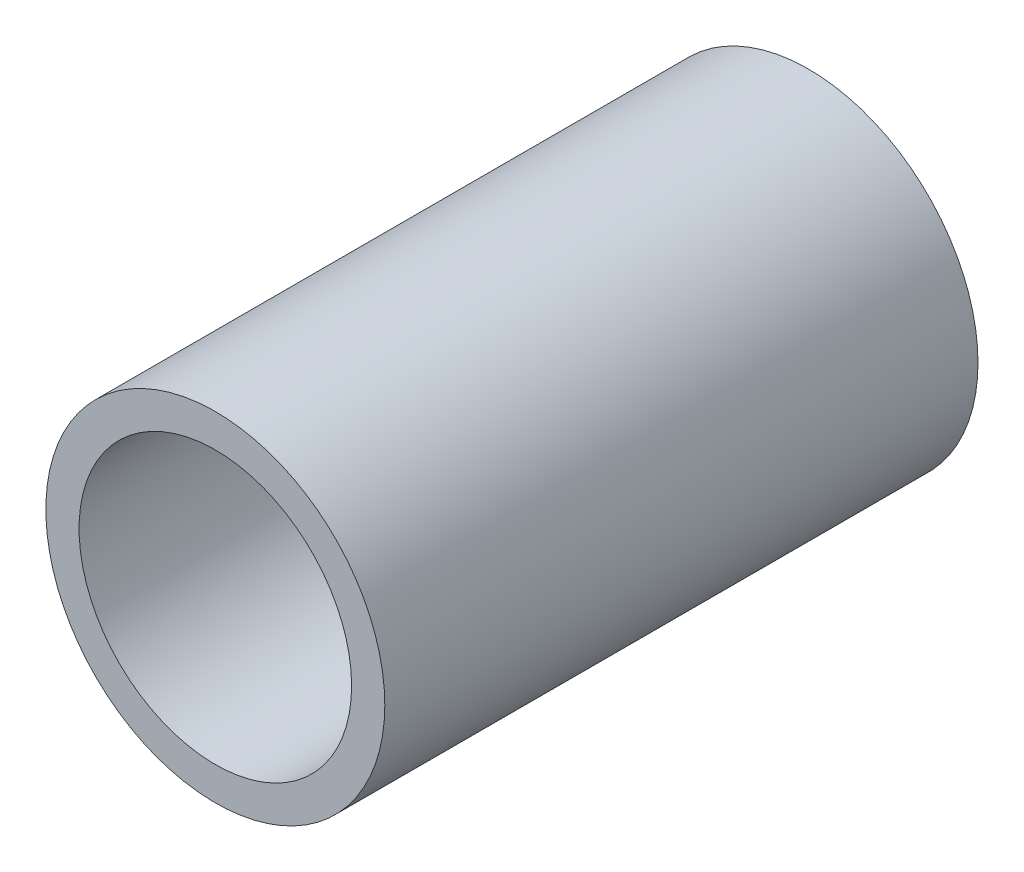
ISO-10303-21;
HEADER;
FILE_DESCRIPTION(('STEP AP214'),'2;1');
FILE_NAME('part.step','',(''),(''),'','','');
FILE_SCHEMA(('AUTOMOTIVE_DESIGN { 1 0 10303 214 1 1 1 1 }'));
ENDSEC;
DATA;
#1=APPLICATION_CONTEXT('core data for automotive mechanical design processes');
#2=APPLICATION_PROTOCOL_DEFINITION('international standard','automotive_design',2000,#1);
#3=PRODUCT_CONTEXT('',#1,'mechanical');
#4=PRODUCT('Part','Part','',(#3));
#5=PRODUCT_RELATED_PRODUCT_CATEGORY('part','',(#4));
#6=PRODUCT_DEFINITION_FORMATION('','',#4);
#7=PRODUCT_DEFINITION_CONTEXT('part definition',#1,'design');
#8=PRODUCT_DEFINITION('design','',#6,#7);
#9=PRODUCT_DEFINITION_SHAPE('','',#8);
#10=(LENGTH_UNIT() NAMED_UNIT(*) SI_UNIT(.MILLI.,.METRE.));
#11=(NAMED_UNIT(*) PLANE_ANGLE_UNIT() SI_UNIT($,.RADIAN.));
#12=(NAMED_UNIT(*) SI_UNIT($,.STERADIAN.) SOLID_ANGLE_UNIT());
#13=UNCERTAINTY_MEASURE_WITH_UNIT(LENGTH_MEASURE(1.E-05),#10,'distance_accuracy_value','');
#14=(GEOMETRIC_REPRESENTATION_CONTEXT(3) GLOBAL_UNCERTAINTY_ASSIGNED_CONTEXT((#13)) GLOBAL_UNIT_ASSIGNED_CONTEXT((#10,
#11,#12)) REPRESENTATION_CONTEXT('',''));
#15=CARTESIAN_POINT('',(0.,0.,0.));
#16=DIRECTION('',(0.,0.,1.));
#17=DIRECTION('',(1.,0.,0.));
#18=AXIS2_PLACEMENT_3D('',#15,#16,#17);
#19=CARTESIAN_POINT('',(0.,0.,70.));
#20=DIRECTION('',(0.,0.,-1.));
#21=DIRECTION('',(-1.,0.,0.));
#22=AXIS2_PLACEMENT_3D('',#19,#20,#21);
#23=CYLINDRICAL_SURFACE('',#22,20.);
#24=CARTESIAN_POINT('',(0.,0.,70.));
#25=DIRECTION('',(0.,0.,1.));
#26=DIRECTION('',(1.,0.,0.));
#27=AXIS2_PLACEMENT_3D('',#24,#25,#26);
#28=CIRCLE('',#27,20.);
#29=CARTESIAN_POINT('',(20.,0.,70.));
#30=VERTEX_POINT('',#29);
#31=EDGE_CURVE('E10',#30,#30,#28,.T.);
#32=ORIENTED_EDGE('',*,*,#31,.F.);
#33=EDGE_LOOP('',(#32));
#34=FACE_BOUND('',#33,.T.);
#35=CARTESIAN_POINT('',(0.,0.,0.));
#36=DIRECTION('',(0.,0.,1.));
#37=DIRECTION('',(1.,0.,0.));
#38=AXIS2_PLACEMENT_3D('',#35,#36,#37);
#39=CIRCLE('',#38,20.);
#40=CARTESIAN_POINT('',(20.,0.,0.));
#41=VERTEX_POINT('',#40);
#42=EDGE_CURVE('E39',#41,#41,#39,.T.);
#43=ORIENTED_EDGE('',*,*,#42,.T.);
#44=EDGE_LOOP('',(#43));
#45=FACE_BOUND('',#44,.T.);
#46=ADVANCED_FACE('F36',(#34,#45),#23,.T.);
#47=CARTESIAN_POINT('',(0.,0.,70.));
#48=DIRECTION('',(0.,0.,1.));
#49=DIRECTION('',(1.,0.,0.));
#50=AXIS2_PLACEMENT_3D('',#47,#48,#49);
#51=PLANE('',#50);
#52=CARTESIAN_POINT('',(0.,0.,70.));
#53=DIRECTION('',(0.,0.,1.));
#54=DIRECTION('',(1.,0.,0.));
#55=AXIS2_PLACEMENT_3D('',#52,#53,#54);
#56=CIRCLE('',#55,16.0812894862419);
#57=CARTESIAN_POINT('',(16.0812894862419,0.,70.));
#58=VERTEX_POINT('',#57);
#59=EDGE_CURVE('E50',#58,#58,#56,.T.);
#60=ORIENTED_EDGE('',*,*,#59,.F.);
#61=EDGE_LOOP('',(#60));
#62=FACE_BOUND('',#61,.T.);
#63=ORIENTED_EDGE('',*,*,#31,.T.);
#64=EDGE_LOOP('',(#63));
#65=FACE_BOUND('',#64,.T.);
#66=ADVANCED_FACE('F67',(#62,#65),#51,.T.);
#67=CARTESIAN_POINT('',(0.,0.,0.));
#68=DIRECTION('',(0.,0.,1.));
#69=DIRECTION('',(1.,0.,0.));
#70=AXIS2_PLACEMENT_3D('',#67,#68,#69);
#71=PLANE('',#70);
#72=ORIENTED_EDGE('',*,*,#42,.F.);
#73=EDGE_LOOP('',(#72));
#74=FACE_BOUND('',#73,.T.);
#75=ADVANCED_FACE('F63',(#74),#71,.F.);
#76=CARTESIAN_POINT('',(0.,0.,10.));
#77=DIRECTION('',(0.,0.,1.));
#78=DIRECTION('',(1.,0.,0.));
#79=AXIS2_PLACEMENT_3D('',#76,#77,#78);
#80=CYLINDRICAL_SURFACE('',#79,16.0812894862419);
#81=CARTESIAN_POINT('',(0.,0.,10.));
#82=DIRECTION('',(0.,0.,1.));
#83=DIRECTION('',(1.,0.,0.));
#84=AXIS2_PLACEMENT_3D('',#81,#82,#83);
#85=CIRCLE('',#84,16.0812894862419);
#86=CARTESIAN_POINT('',(16.0812894862419,0.,10.));
#87=VERTEX_POINT('',#86);
#88=EDGE_CURVE('E48',#87,#87,#85,.T.);
#89=CARTESIAN_POINT('',(16.0812894862419,0.,10.));
#90=CARTESIAN_POINT('',(16.0812894862419,0.,10.625));
#91=CARTESIAN_POINT('',(16.0812894862419,0.,11.25));
#92=CARTESIAN_POINT('',(16.0812894862419,0.,12.5));
#93=CARTESIAN_POINT('',(16.0812894862419,0.,13.125));
#94=CARTESIAN_POINT('',(16.0812894862419,0.,14.375));
#95=CARTESIAN_POINT('',(16.0812894862419,0.,15.));
#96=CARTESIAN_POINT('',(16.0812894862419,0.,16.25));
#97=CARTESIAN_POINT('',(16.0812894862419,0.,16.875));
#98=CARTESIAN_POINT('',(16.0812894862419,0.,18.125));
#99=CARTESIAN_POINT('',(16.0812894862419,0.,18.75));
#100=CARTESIAN_POINT('',(16.0812894862419,0.,20.));
#101=CARTESIAN_POINT('',(16.0812894862419,0.,20.625));
#102=CARTESIAN_POINT('',(16.0812894862419,0.,21.875));
#103=CARTESIAN_POINT('',(16.0812894862419,0.,22.5));
#104=CARTESIAN_POINT('',(16.0812894862419,0.,23.75));
#105=CARTESIAN_POINT('',(16.0812894862419,0.,24.375));
#106=CARTESIAN_POINT('',(16.0812894862419,0.,25.625));
#107=CARTESIAN_POINT('',(16.0812894862419,0.,26.25));
#108=CARTESIAN_POINT('',(16.0812894862419,0.,27.5));
#109=CARTESIAN_POINT('',(16.0812894862419,0.,28.125));
#110=CARTESIAN_POINT('',(16.0812894862419,0.,29.375));
#111=CARTESIAN_POINT('',(16.0812894862419,0.,30.));
#112=CARTESIAN_POINT('',(16.0812894862419,0.,31.25));
#113=CARTESIAN_POINT('',(16.0812894862419,0.,31.875));
#114=CARTESIAN_POINT('',(16.0812894862419,0.,33.125));
#115=CARTESIAN_POINT('',(16.0812894862419,0.,33.75));
#116=CARTESIAN_POINT('',(16.0812894862419,0.,35.));
#117=CARTESIAN_POINT('',(16.0812894862419,0.,35.625));
#118=CARTESIAN_POINT('',(16.0812894862419,0.,36.875));
#119=CARTESIAN_POINT('',(16.0812894862419,0.,37.5));
#120=CARTESIAN_POINT('',(16.0812894862419,0.,38.75));
#121=CARTESIAN_POINT('',(16.0812894862419,0.,39.375));
#122=CARTESIAN_POINT('',(16.0812894862419,0.,40.625));
#123=CARTESIAN_POINT('',(16.0812894862419,0.,41.25));
#124=CARTESIAN_POINT('',(16.0812894862419,0.,42.5));
#125=CARTESIAN_POINT('',(16.0812894862419,0.,43.125));
#126=CARTESIAN_POINT('',(16.0812894862419,0.,44.375));
#127=CARTESIAN_POINT('',(16.0812894862419,0.,45.));
#128=CARTESIAN_POINT('',(16.0812894862419,0.,46.25));
#129=CARTESIAN_POINT('',(16.0812894862419,0.,46.875));
#130=CARTESIAN_POINT('',(16.0812894862419,0.,48.125));
#131=CARTESIAN_POINT('',(16.0812894862419,0.,48.75));
#132=CARTESIAN_POINT('',(16.0812894862419,0.,50.));
#133=CARTESIAN_POINT('',(16.0812894862419,0.,50.625));
#134=CARTESIAN_POINT('',(16.0812894862419,0.,51.875));
#135=CARTESIAN_POINT('',(16.0812894862419,0.,52.5));
#136=CARTESIAN_POINT('',(16.0812894862419,0.,53.75));
#137=CARTESIAN_POINT('',(16.0812894862419,0.,54.375));
#138=CARTESIAN_POINT('',(16.0812894862419,0.,55.625));
#139=CARTESIAN_POINT('',(16.0812894862419,0.,56.25));
#140=CARTESIAN_POINT('',(16.0812894862419,0.,57.5));
#141=CARTESIAN_POINT('',(16.0812894862419,0.,58.125));
#142=CARTESIAN_POINT('',(16.0812894862419,0.,59.375));
#143=CARTESIAN_POINT('',(16.0812894862419,0.,60.));
#144=CARTESIAN_POINT('',(16.0812894862419,0.,61.25));
#145=CARTESIAN_POINT('',(16.0812894862419,0.,61.875));
#146=CARTESIAN_POINT('',(16.0812894862419,0.,63.125));
#147=CARTESIAN_POINT('',(16.0812894862419,0.,63.75));
#148=CARTESIAN_POINT('',(16.0812894862419,0.,65.));
#149=CARTESIAN_POINT('',(16.0812894862419,0.,65.625));
#150=CARTESIAN_POINT('',(16.0812894862419,0.,66.875));
#151=CARTESIAN_POINT('',(16.0812894862419,0.,67.5));
#152=CARTESIAN_POINT('',(16.0812894862419,0.,68.75));
#153=CARTESIAN_POINT('',(16.0812894862419,0.,69.375));
#154=CARTESIAN_POINT('',(16.0812894862419,0.,70.));
#155=B_SPLINE_CURVE_WITH_KNOTS('',3,(#89,#90,#91,#92,#93,#94,#95,#96,#97,#98,#99,#100,#101,#102,
#103,#104,#105,#106,#107,#108,#109,#110,#111,#112,#113,#114,#115,#116,#117,#118,#119,#120,#121,
#122,#123,#124,#125,#126,#127,#128,#129,#130,#131,#132,#133,#134,#135,#136,#137,#138,#139,#140,
#141,#142,#143,#144,#145,#146,#147,#148,#149,#150,#151,#152,#153,#154),.UNSPECIFIED.,.F.,.F.,(4,
2,2,2,2,2,2,2,2,2,2,2,2,2,2,2,2,2,2,2,2,2,2,2,2,2,2,2,2,2,2,2,4),(0.,1.875,3.75,5.625,7.5,9.375,
11.25,13.125,15.,16.875,18.75,20.625,22.5,24.375,26.25,28.125,30.,31.875,33.75,35.625,37.5,
39.375,41.25,43.125,45.,46.875,48.75,50.625,52.5,54.375,56.25,58.125,60.),.UNSPECIFIED.);
#156=EDGE_CURVE('BSEAM60',#87,#58,#155,.T.);
#157=ORIENTED_EDGE('',*,*,#88,.F.);
#158=ORIENTED_EDGE('',*,*,#59,.T.);
#159=ORIENTED_EDGE('',*,*,#156,.T.);
#160=ORIENTED_EDGE('',*,*,#156,.F.);
#161=EDGE_LOOP('',(#157,#159,#158,#160));
#162=FACE_BOUND('',#161,.T.);
#163=ADVANCED_FACE('F60',(#162),#80,.F.);
#164=CARTESIAN_POINT('',(0.,0.,10.));
#165=DIRECTION('',(0.,0.,1.));
#166=DIRECTION('',(1.,0.,0.));
#167=AXIS2_PLACEMENT_3D('',#164,#165,#166);
#168=PLANE('',#167);
#169=ORIENTED_EDGE('',*,*,#88,.T.);
#170=EDGE_LOOP('',(#169));
#171=FACE_BOUND('',#170,.T.);
#172=ADVANCED_FACE('F58',(#171),#168,.T.);
#173=CLOSED_SHELL('',(#46,#66,#75,#163,#172));
#174=MANIFOLD_SOLID_BREP('B2',#173);
#175=ADVANCED_BREP_SHAPE_REPRESENTATION('',(#18,#174),#14);
#176=SHAPE_DEFINITION_REPRESENTATION(#9,#175);
ENDSEC;
END-ISO-10303-21;
